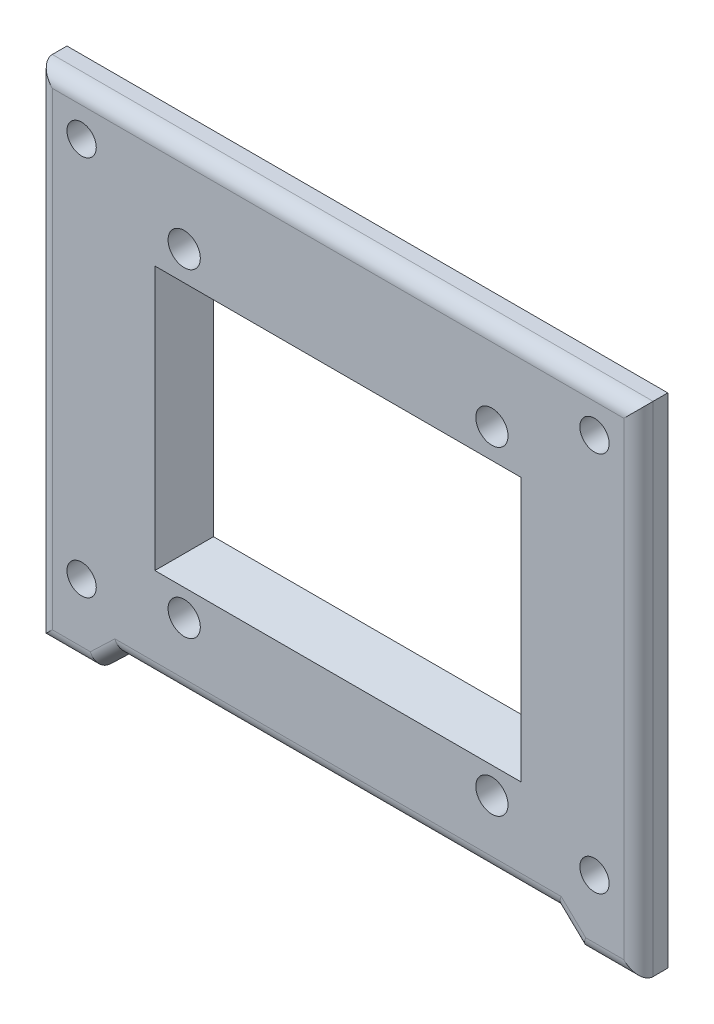
ISO-10303-21;
HEADER;
FILE_DESCRIPTION(('STEP AP214'),'2;1');
FILE_NAME('part.step','',(''),(''),'','','');
FILE_SCHEMA(('AUTOMOTIVE_DESIGN { 1 0 10303 214 1 1 1 1 }'));
ENDSEC;
DATA;
#1=APPLICATION_CONTEXT('core data for automotive mechanical design processes');
#2=APPLICATION_PROTOCOL_DEFINITION('international standard','automotive_design',2000,#1);
#3=PRODUCT_CONTEXT('',#1,'mechanical');
#4=PRODUCT('Part','Part','',(#3));
#5=PRODUCT_RELATED_PRODUCT_CATEGORY('part','',(#4));
#6=PRODUCT_DEFINITION_FORMATION('','',#4);
#7=PRODUCT_DEFINITION_CONTEXT('part definition',#1,'design');
#8=PRODUCT_DEFINITION('design','',#6,#7);
#9=PRODUCT_DEFINITION_SHAPE('','',#8);
#10=(LENGTH_UNIT() NAMED_UNIT(*) SI_UNIT(.MILLI.,.METRE.));
#11=(NAMED_UNIT(*) PLANE_ANGLE_UNIT() SI_UNIT($,.RADIAN.));
#12=(NAMED_UNIT(*) SI_UNIT($,.STERADIAN.) SOLID_ANGLE_UNIT());
#13=UNCERTAINTY_MEASURE_WITH_UNIT(LENGTH_MEASURE(1.E-05),#10,'distance_accuracy_value','');
#14=(GEOMETRIC_REPRESENTATION_CONTEXT(3) GLOBAL_UNCERTAINTY_ASSIGNED_CONTEXT((#13)) GLOBAL_UNIT_ASSIGNED_CONTEXT((#10,
#11,#12)) REPRESENTATION_CONTEXT('',''));
#15=CARTESIAN_POINT('',(0.,0.,0.));
#16=DIRECTION('',(0.,0.,1.));
#17=DIRECTION('',(1.,0.,0.));
#18=AXIS2_PLACEMENT_3D('',#15,#16,#17);
#19=CARTESIAN_POINT('',(0.,0.,2.));
#20=DIRECTION('',(0.,0.,1.));
#21=DIRECTION('',(1.,0.,0.));
#22=AXIS2_PLACEMENT_3D('',#19,#20,#21);
#23=PLANE('',#22);
#24=DIRECTION('',(0.,-1.,0.));
#25=VECTOR('',#24,1.);
#26=CARTESIAN_POINT('',(11.5716488957227,0.,2.));
#27=LINE('',#26,#25);
#28=CARTESIAN_POINT('',(11.5716488957227,16.9069626274452,2.));
#29=VERTEX_POINT('',#28);
#30=CARTESIAN_POINT('',(11.5716488957227,-1.09303737255483,2.));
#31=VERTEX_POINT('',#30);
#32=EDGE_CURVE('E54',#29,#31,#27,.T.);
#33=ORIENTED_EDGE('',*,*,#32,.T.);
#34=DIRECTION('',(-1.,0.,0.));
#35=VECTOR('',#34,1.);
#36=CARTESIAN_POINT('',(0.,-1.09303737255483,2.));
#37=LINE('',#36,#35);
#38=CARTESIAN_POINT('',(-13.4283511042773,-1.09303737255483,2.));
#39=VERTEX_POINT('',#38);
#40=EDGE_CURVE('E11',#31,#39,#37,.T.);
#41=ORIENTED_EDGE('',*,*,#40,.T.);
#42=DIRECTION('',(0.,1.,0.));
#43=VECTOR('',#42,1.);
#44=CARTESIAN_POINT('',(-13.4283511042773,0.,2.));
#45=LINE('',#44,#43);
#46=CARTESIAN_POINT('',(-13.4283511042773,16.9069626274452,2.));
#47=VERTEX_POINT('',#46);
#48=EDGE_CURVE('E173',#39,#47,#45,.T.);
#49=ORIENTED_EDGE('',*,*,#48,.T.);
#50=DIRECTION('',(1.,0.,0.));
#51=VECTOR('',#50,1.);
#52=CARTESIAN_POINT('',(0.,16.9069626274452,2.));
#53=LINE('',#52,#51);
#54=EDGE_CURVE('E296',#47,#29,#53,.T.);
#55=ORIENTED_EDGE('',*,*,#54,.T.);
#56=EDGE_LOOP('',(#33,#41,#49,#55));
#57=FACE_BOUND('',#56,.T.);
#58=CARTESIAN_POINT('',(-18.4283511042773,-4.09303737255482,2.));
#59=DIRECTION('',(0.,0.,1.));
#60=DIRECTION('',(1.,0.,0.));
#61=AXIS2_PLACEMENT_3D('',#58,#59,#60);
#62=CIRCLE('',#61,1.);
#63=CARTESIAN_POINT('',(-17.4283511042773,-4.09303737255482,2.));
#64=VERTEX_POINT('',#63);
#65=EDGE_CURVE('E358',#64,#64,#62,.T.);
#66=ORIENTED_EDGE('',*,*,#65,.F.);
#67=EDGE_LOOP('',(#66));
#68=FACE_BOUND('',#67,.T.);
#69=CARTESIAN_POINT('',(16.5716488957227,21.9069626274452,2.));
#70=DIRECTION('',(0.,0.,1.));
#71=DIRECTION('',(1.,0.,0.));
#72=AXIS2_PLACEMENT_3D('',#69,#70,#71);
#73=CIRCLE('',#72,1.);
#74=CARTESIAN_POINT('',(17.5716488957227,21.9069626274452,2.));
#75=VERTEX_POINT('',#74);
#76=EDGE_CURVE('E350',#75,#75,#73,.T.);
#77=ORIENTED_EDGE('',*,*,#76,.F.);
#78=EDGE_LOOP('',(#77));
#79=FACE_BOUND('',#78,.T.);
#80=CARTESIAN_POINT('',(16.5716488957227,-4.09303737255482,2.));
#81=DIRECTION('',(0.,0.,1.));
#82=DIRECTION('',(1.,0.,0.));
#83=AXIS2_PLACEMENT_3D('',#80,#81,#82);
#84=CIRCLE('',#83,1.);
#85=CARTESIAN_POINT('',(17.5716488957227,-4.09303737255482,2.));
#86=VERTEX_POINT('',#85);
#87=EDGE_CURVE('E341',#86,#86,#84,.T.);
#88=ORIENTED_EDGE('',*,*,#87,.F.);
#89=EDGE_LOOP('',(#88));
#90=FACE_BOUND('',#89,.T.);
#91=CARTESIAN_POINT('',(-18.4283511042773,21.9069626274452,2.));
#92=DIRECTION('',(0.,0.,1.));
#93=DIRECTION('',(1.,0.,0.));
#94=AXIS2_PLACEMENT_3D('',#91,#92,#93);
#95=CIRCLE('',#94,1.);
#96=CARTESIAN_POINT('',(-17.4283511042773,21.9069626274452,2.));
#97=VERTEX_POINT('',#96);
#98=EDGE_CURVE('E357',#97,#97,#95,.T.);
#99=ORIENTED_EDGE('',*,*,#98,.F.);
#100=EDGE_LOOP('',(#99));
#101=FACE_BOUND('',#100,.T.);
#102=DIRECTION('',(0.722490361505851,0.691380993035783,0.));
#103=VECTOR('',#102,1.);
#104=CARTESIAN_POINT('',(-16.4477385220579,-6.77054701104897,2.));
#105=LINE('',#104,#103);
#106=CARTESIAN_POINT('',(-17.8297356394171,-8.09303737255482,2.));
#107=VERTEX_POINT('',#106);
#108=CARTESIAN_POINT('',(-16.1577420641619,-6.49303737255482,2.));
#109=VERTEX_POINT('',#108);
#110=EDGE_CURVE('E261',#107,#109,#105,.T.);
#111=ORIENTED_EDGE('',*,*,#110,.T.);
#112=DIRECTION('',(1.,0.,0.));
#113=VECTOR('',#112,1.);
#114=CARTESIAN_POINT('',(13.8996553204676,-6.49303737255482,2.));
#115=LINE('',#114,#113);
#116=CARTESIAN_POINT('',(14.3010398556073,-6.49303737255482,2.));
#117=VERTEX_POINT('',#116);
#118=EDGE_CURVE('E268',#109,#117,#115,.T.);
#119=ORIENTED_EDGE('',*,*,#118,.T.);
#120=DIRECTION('',(0.722490361505851,-0.691380993035783,0.));
#121=VECTOR('',#120,1.);
#122=CARTESIAN_POINT('',(16.2630298887585,-8.37054701104897,2.));
#123=LINE('',#122,#121);
#124=CARTESIAN_POINT('',(15.9730334308625,-8.09303737255482,2.));
#125=VERTEX_POINT('',#124);
#126=EDGE_CURVE('E264',#117,#125,#123,.T.);
#127=ORIENTED_EDGE('',*,*,#126,.T.);
#128=DIRECTION('',(1.,0.,0.));
#129=VECTOR('',#128,1.);
#130=CARTESIAN_POINT('',(19.5716488957227,-8.09303737255483,2.));
#131=LINE('',#130,#129);
#132=CARTESIAN_POINT('',(18.5716488957227,-8.09303737255483,2.));
#133=VERTEX_POINT('',#132);
#134=EDGE_CURVE('E255',#125,#133,#131,.T.);
#135=ORIENTED_EDGE('',*,*,#134,.T.);
#136=DIRECTION('',(0.,1.,0.));
#137=VECTOR('',#136,1.);
#138=CARTESIAN_POINT('',(18.5716488957227,24.9069626274452,2.));
#139=LINE('',#138,#137);
#140=CARTESIAN_POINT('',(18.5716488957227,23.9069626274452,2.));
#141=VERTEX_POINT('',#140);
#142=EDGE_CURVE('E252',#133,#141,#139,.T.);
#143=ORIENTED_EDGE('',*,*,#142,.T.);
#144=DIRECTION('',(-1.,0.,0.));
#145=VECTOR('',#144,1.);
#146=CARTESIAN_POINT('',(-21.4283511042773,23.9069626274452,2.));
#147=LINE('',#146,#145);
#148=CARTESIAN_POINT('',(-20.4283511042773,23.9069626274452,2.));
#149=VERTEX_POINT('',#148);
#150=EDGE_CURVE('E249',#141,#149,#147,.T.);
#151=ORIENTED_EDGE('',*,*,#150,.T.);
#152=DIRECTION('',(0.,-1.,0.));
#153=VECTOR('',#152,1.);
#154=CARTESIAN_POINT('',(-20.4283511042773,-9.09303737255483,2.));
#155=LINE('',#154,#153);
#156=CARTESIAN_POINT('',(-20.4283511042773,-8.09303737255483,2.));
#157=VERTEX_POINT('',#156);
#158=EDGE_CURVE('E246',#149,#157,#155,.T.);
#159=ORIENTED_EDGE('',*,*,#158,.T.);
#160=DIRECTION('',(1.,0.,0.));
#161=VECTOR('',#160,1.);
#162=CARTESIAN_POINT('',(-17.4283511042773,-8.09303737255482,2.));
#163=LINE('',#162,#161);
#164=EDGE_CURVE('E258',#157,#107,#163,.T.);
#165=ORIENTED_EDGE('',*,*,#164,.T.);
#166=EDGE_LOOP('',(#111,#119,#127,#135,#143,#151,#159,#165));
#167=FACE_BOUND('',#166,.T.);
#168=CARTESIAN_POINT('',(9.57164889572272,18.9069626274452,2.));
#169=DIRECTION('',(0.,0.,1.));
#170=DIRECTION('',(1.,0.,0.));
#171=AXIS2_PLACEMENT_3D('',#168,#169,#170);
#172=CIRCLE('',#171,1.1);
#173=CARTESIAN_POINT('',(10.6716488957227,18.9069626274452,2.));
#174=VERTEX_POINT('',#173);
#175=EDGE_CURVE('E383',#174,#174,#172,.T.);
#176=ORIENTED_EDGE('',*,*,#175,.F.);
#177=EDGE_LOOP('',(#176));
#178=FACE_BOUND('',#177,.T.);
#179=CARTESIAN_POINT('',(-11.4283511042773,18.9069626274452,2.));
#180=DIRECTION('',(0.,0.,1.));
#181=DIRECTION('',(1.,0.,0.));
#182=AXIS2_PLACEMENT_3D('',#179,#180,#181);
#183=CIRCLE('',#182,1.1);
#184=CARTESIAN_POINT('',(-10.3283511042773,18.9069626274452,2.));
#185=VERTEX_POINT('',#184);
#186=EDGE_CURVE('E170',#185,#185,#183,.T.);
#187=ORIENTED_EDGE('',*,*,#186,.F.);
#188=EDGE_LOOP('',(#187));
#189=FACE_BOUND('',#188,.T.);
#190=CARTESIAN_POINT('',(-11.4283511042773,-2.89303737255482,2.));
#191=DIRECTION('',(0.,0.,1.));
#192=DIRECTION('',(1.,0.,0.));
#193=AXIS2_PLACEMENT_3D('',#190,#191,#192);
#194=CIRCLE('',#193,1.1);
#195=CARTESIAN_POINT('',(-10.3283511042773,-2.89303737255482,2.));
#196=VERTEX_POINT('',#195);
#197=EDGE_CURVE('E391',#196,#196,#194,.T.);
#198=ORIENTED_EDGE('',*,*,#197,.F.);
#199=EDGE_LOOP('',(#198));
#200=FACE_BOUND('',#199,.T.);
#201=CARTESIAN_POINT('',(9.57164889572272,-2.89303737255482,2.));
#202=DIRECTION('',(0.,0.,1.));
#203=DIRECTION('',(1.,0.,0.));
#204=AXIS2_PLACEMENT_3D('',#201,#202,#203);
#205=CIRCLE('',#204,1.1);
#206=CARTESIAN_POINT('',(10.6716488957227,-2.89303737255482,2.));
#207=VERTEX_POINT('',#206);
#208=EDGE_CURVE('E375',#207,#207,#205,.T.);
#209=ORIENTED_EDGE('',*,*,#208,.F.);
#210=EDGE_LOOP('',(#209));
#211=FACE_BOUND('',#210,.T.);
#212=ADVANCED_FACE('F43',(#57,#68,#79,#90,#101,#167,#178,#189,#200,#211),#23,.T.);
#213=CARTESIAN_POINT('',(0.,0.,0.));
#214=DIRECTION('',(0.,0.,1.));
#215=DIRECTION('',(1.,0.,0.));
#216=AXIS2_PLACEMENT_3D('',#213,#214,#215);
#217=PLANE('',#216);
#218=CARTESIAN_POINT('',(-18.4283511042773,-4.09303737255482,0.));
#219=DIRECTION('',(0.,0.,1.));
#220=DIRECTION('',(1.,0.,0.));
#221=AXIS2_PLACEMENT_3D('',#218,#219,#220);
#222=CIRCLE('',#221,1.);
#223=CARTESIAN_POINT('',(-17.4283511042773,-4.09303737255482,0.));
#224=VERTEX_POINT('',#223);
#225=EDGE_CURVE('E353',#224,#224,#222,.T.);
#226=ORIENTED_EDGE('',*,*,#225,.T.);
#227=EDGE_LOOP('',(#226));
#228=FACE_BOUND('',#227,.T.);
#229=CARTESIAN_POINT('',(16.5716488957227,21.9069626274452,0.));
#230=DIRECTION('',(0.,0.,1.));
#231=DIRECTION('',(1.,0.,0.));
#232=AXIS2_PLACEMENT_3D('',#229,#230,#231);
#233=CIRCLE('',#232,1.);
#234=CARTESIAN_POINT('',(17.5716488957227,21.9069626274452,0.));
#235=VERTEX_POINT('',#234);
#236=EDGE_CURVE('E362',#235,#235,#233,.T.);
#237=ORIENTED_EDGE('',*,*,#236,.T.);
#238=EDGE_LOOP('',(#237));
#239=FACE_BOUND('',#238,.T.);
#240=CARTESIAN_POINT('',(16.5716488957227,-4.09303737255482,0.));
#241=DIRECTION('',(0.,0.,1.));
#242=DIRECTION('',(1.,0.,0.));
#243=AXIS2_PLACEMENT_3D('',#240,#241,#242);
#244=CIRCLE('',#243,1.);
#245=CARTESIAN_POINT('',(17.5716488957227,-4.09303737255482,0.));
#246=VERTEX_POINT('',#245);
#247=EDGE_CURVE('E344',#246,#246,#244,.T.);
#248=ORIENTED_EDGE('',*,*,#247,.T.);
#249=EDGE_LOOP('',(#248));
#250=FACE_BOUND('',#249,.T.);
#251=CARTESIAN_POINT('',(-18.4283511042773,21.9069626274452,0.));
#252=DIRECTION('',(0.,0.,1.));
#253=DIRECTION('',(1.,0.,0.));
#254=AXIS2_PLACEMENT_3D('',#251,#252,#253);
#255=CIRCLE('',#254,1.);
#256=CARTESIAN_POINT('',(-17.4283511042773,21.9069626274452,0.));
#257=VERTEX_POINT('',#256);
#258=EDGE_CURVE('E301',#257,#257,#255,.T.);
#259=ORIENTED_EDGE('',*,*,#258,.T.);
#260=EDGE_LOOP('',(#259));
#261=FACE_BOUND('',#260,.T.);
#262=DIRECTION('',(0.,-1.,0.));
#263=VECTOR('',#262,1.);
#264=CARTESIAN_POINT('',(-21.4283511042773,24.9069626274452,0.));
#265=LINE('',#264,#263);
#266=CARTESIAN_POINT('',(-21.4283511042773,24.9069626274452,0.));
#267=VERTEX_POINT('',#266);
#268=CARTESIAN_POINT('',(-21.4283511042773,-9.09303737255483,0.));
#269=VERTEX_POINT('',#268);
#270=EDGE_CURVE('E190',#267,#269,#265,.T.);
#271=ORIENTED_EDGE('',*,*,#270,.F.);
#272=DIRECTION('',(-1.,0.,0.));
#273=VECTOR('',#272,1.);
#274=CARTESIAN_POINT('',(-21.4283511042773,24.9069626274452,0.));
#275=LINE('',#274,#273);
#276=CARTESIAN_POINT('',(19.5716488957227,24.9069626274452,0.));
#277=VERTEX_POINT('',#276);
#278=EDGE_CURVE('E218',#277,#267,#275,.T.);
#279=ORIENTED_EDGE('',*,*,#278,.F.);
#280=DIRECTION('',(0.,1.,0.));
#281=VECTOR('',#280,1.);
#282=CARTESIAN_POINT('',(19.5716488957227,24.9069626274452,0.));
#283=LINE('',#282,#281);
#284=CARTESIAN_POINT('',(19.5716488957227,-9.09303737255483,0.));
#285=VERTEX_POINT('',#284);
#286=EDGE_CURVE('E214',#285,#277,#283,.T.);
#287=ORIENTED_EDGE('',*,*,#286,.F.);
#288=DIRECTION('',(1.,0.,0.));
#289=VECTOR('',#288,1.);
#290=CARTESIAN_POINT('',(17.6967719504283,-9.09303737255482,0.));
#291=LINE('',#290,#289);
#292=CARTESIAN_POINT('',(15.5716488957227,-9.09303737255482,0.));
#293=VERTEX_POINT('',#292);
#294=EDGE_CURVE('E210',#293,#285,#291,.T.);
#295=ORIENTED_EDGE('',*,*,#294,.F.);
#296=DIRECTION('',(0.722490361505851,-0.691380993035783,0.));
#297=VECTOR('',#296,1.);
#298=CARTESIAN_POINT('',(15.5716488957227,-9.09303737255482,0.));
#299=LINE('',#298,#297);
#300=CARTESIAN_POINT('',(13.8996553204676,-7.49303737255482,0.));
#301=VERTEX_POINT('',#300);
#302=EDGE_CURVE('E206',#301,#293,#299,.T.);
#303=ORIENTED_EDGE('',*,*,#302,.F.);
#304=DIRECTION('',(1.,0.,0.));
#305=VECTOR('',#304,1.);
#306=CARTESIAN_POINT('',(-15.7563575290221,-7.49303737255482,0.));
#307=LINE('',#306,#305);
#308=CARTESIAN_POINT('',(-15.7563575290221,-7.49303737255482,0.));
#309=VERTEX_POINT('',#308);
#310=EDGE_CURVE('E202',#309,#301,#307,.T.);
#311=ORIENTED_EDGE('',*,*,#310,.F.);
#312=DIRECTION('',(0.722490361505851,0.691380993035783,0.));
#313=VECTOR('',#312,1.);
#314=CARTESIAN_POINT('',(-17.4283511042773,-9.09303737255482,0.));
#315=LINE('',#314,#313);
#316=CARTESIAN_POINT('',(-17.4283511042773,-9.09303737255482,0.));
#317=VERTEX_POINT('',#316);
#318=EDGE_CURVE('E198',#317,#309,#315,.T.);
#319=ORIENTED_EDGE('',*,*,#318,.F.);
#320=DIRECTION('',(1.,0.,0.));
#321=VECTOR('',#320,1.);
#322=CARTESIAN_POINT('',(-21.4283511042773,-9.09303737255483,0.));
#323=LINE('',#322,#321);
#324=EDGE_CURVE('E194',#269,#317,#323,.T.);
#325=ORIENTED_EDGE('',*,*,#324,.F.);
#326=EDGE_LOOP('',(#271,#279,#287,#295,#303,#311,#319,#325));
#327=FACE_BOUND('',#326,.T.);
#328=DIRECTION('',(0.,-1.,0.));
#329=VECTOR('',#328,1.);
#330=CARTESIAN_POINT('',(-11.4283511042773,14.9069626274452,0.));
#331=LINE('',#330,#329);
#332=CARTESIAN_POINT('',(-11.4283511042773,14.9069626274452,0.));
#333=VERTEX_POINT('',#332);
#334=CARTESIAN_POINT('',(-11.4283511042773,0.906962627445175,0.));
#335=VERTEX_POINT('',#334);
#336=EDGE_CURVE('E160',#333,#335,#331,.T.);
#337=ORIENTED_EDGE('',*,*,#336,.T.);
#338=DIRECTION('',(1.,0.,0.));
#339=VECTOR('',#338,1.);
#340=CARTESIAN_POINT('',(-11.4283511042773,0.906962627445175,0.));
#341=LINE('',#340,#339);
#342=CARTESIAN_POINT('',(9.57164889572272,0.906962627445175,0.));
#343=VERTEX_POINT('',#342);
#344=EDGE_CURVE('E163',#335,#343,#341,.T.);
#345=ORIENTED_EDGE('',*,*,#344,.T.);
#346=DIRECTION('',(0.,1.,0.));
#347=VECTOR('',#346,1.);
#348=CARTESIAN_POINT('',(9.57164889572272,14.9069626274452,0.));
#349=LINE('',#348,#347);
#350=CARTESIAN_POINT('',(9.57164889572272,14.9069626274452,0.));
#351=VERTEX_POINT('',#350);
#352=EDGE_CURVE('E182',#343,#351,#349,.T.);
#353=ORIENTED_EDGE('',*,*,#352,.T.);
#354=DIRECTION('',(-1.,0.,0.));
#355=VECTOR('',#354,1.);
#356=CARTESIAN_POINT('',(-11.4283511042773,14.9069626274452,0.));
#357=LINE('',#356,#355);
#358=EDGE_CURVE('E165',#351,#333,#357,.T.);
#359=ORIENTED_EDGE('',*,*,#358,.T.);
#360=EDGE_LOOP('',(#337,#345,#353,#359));
#361=FACE_BOUND('',#360,.T.);
#362=CARTESIAN_POINT('',(-11.4283511042773,18.9069626274452,0.));
#363=DIRECTION('',(0.,0.,1.));
#364=DIRECTION('',(1.,0.,0.));
#365=AXIS2_PLACEMENT_3D('',#362,#363,#364);
#366=CIRCLE('',#365,1.1);
#367=CARTESIAN_POINT('',(-10.3283511042773,18.9069626274452,0.));
#368=VERTEX_POINT('',#367);
#369=EDGE_CURVE('E395',#368,#368,#366,.T.);
#370=ORIENTED_EDGE('',*,*,#369,.T.);
#371=EDGE_LOOP('',(#370));
#372=FACE_BOUND('',#371,.T.);
#373=CARTESIAN_POINT('',(-11.4283511042773,-2.89303737255482,0.));
#374=DIRECTION('',(0.,0.,1.));
#375=DIRECTION('',(1.,0.,0.));
#376=AXIS2_PLACEMENT_3D('',#373,#374,#375);
#377=CIRCLE('',#376,1.1);
#378=CARTESIAN_POINT('',(-10.3283511042773,-2.89303737255482,0.));
#379=VERTEX_POINT('',#378);
#380=EDGE_CURVE('E387',#379,#379,#377,.T.);
#381=ORIENTED_EDGE('',*,*,#380,.T.);
#382=EDGE_LOOP('',(#381));
#383=FACE_BOUND('',#382,.T.);
#384=CARTESIAN_POINT('',(9.57164889572272,18.9069626274452,0.));
#385=DIRECTION('',(0.,0.,1.));
#386=DIRECTION('',(1.,0.,0.));
#387=AXIS2_PLACEMENT_3D('',#384,#385,#386);
#388=CIRCLE('',#387,1.1);
#389=CARTESIAN_POINT('',(10.6716488957227,18.9069626274452,0.));
#390=VERTEX_POINT('',#389);
#391=EDGE_CURVE('E379',#390,#390,#388,.T.);
#392=ORIENTED_EDGE('',*,*,#391,.T.);
#393=EDGE_LOOP('',(#392));
#394=FACE_BOUND('',#393,.T.);
#395=CARTESIAN_POINT('',(9.57164889572272,-2.89303737255482,0.));
#396=DIRECTION('',(0.,0.,1.));
#397=DIRECTION('',(1.,0.,0.));
#398=AXIS2_PLACEMENT_3D('',#395,#396,#397);
#399=CIRCLE('',#398,1.1);
#400=CARTESIAN_POINT('',(10.6716488957227,-2.89303737255482,0.));
#401=VERTEX_POINT('',#400);
#402=EDGE_CURVE('E328',#401,#401,#399,.T.);
#403=ORIENTED_EDGE('',*,*,#402,.T.);
#404=EDGE_LOOP('',(#403));
#405=FACE_BOUND('',#404,.T.);
#406=ADVANCED_FACE('F161',(#228,#239,#250,#261,#327,#361,#372,#383,#394,#405),#217,.F.);
#407=CARTESIAN_POINT('',(-21.4283511042773,24.9069626274452,2.));
#408=DIRECTION('',(1.,0.,0.));
#409=DIRECTION('',(0.,0.,-1.));
#410=AXIS2_PLACEMENT_3D('',#407,#408,#409);
#411=PLANE('',#410);
#412=DIRECTION('',(0.,0.,-1.));
#413=VECTOR('',#412,1.);
#414=CARTESIAN_POINT('',(-21.4283511042773,-9.09303737255483,2.));
#415=LINE('',#414,#413);
#416=CARTESIAN_POINT('',(-21.4283511042773,-9.09303737255483,1.));
#417=VERTEX_POINT('',#416);
#418=EDGE_CURVE('E243',#417,#269,#415,.T.);
#419=ORIENTED_EDGE('',*,*,#418,.F.);
#420=DIRECTION('',(0.,-1.,0.));
#421=VECTOR('',#420,1.);
#422=CARTESIAN_POINT('',(-21.4283511042773,24.9069626274452,1.));
#423=LINE('',#422,#421);
#424=CARTESIAN_POINT('',(-21.4283511042773,24.9069626274452,1.));
#425=VERTEX_POINT('',#424);
#426=EDGE_CURVE('E293',#417,#425,#423,.F.);
#427=ORIENTED_EDGE('',*,*,#426,.T.);
#428=DIRECTION('',(0.,0.,-1.));
#429=VECTOR('',#428,1.);
#430=CARTESIAN_POINT('',(-21.4283511042773,24.9069626274452,2.));
#431=LINE('',#430,#429);
#432=EDGE_CURVE('E222',#425,#267,#431,.T.);
#433=ORIENTED_EDGE('',*,*,#432,.T.);
#434=ORIENTED_EDGE('',*,*,#270,.T.);
#435=EDGE_LOOP('',(#419,#427,#433,#434));
#436=FACE_BOUND('',#435,.T.);
#437=ADVANCED_FACE('F427',(#436),#411,.F.);
#438=CARTESIAN_POINT('',(-21.4283511042773,-9.09303737255483,2.));
#439=DIRECTION('',(0.,1.,0.));
#440=DIRECTION('',(-1.,0.,0.));
#441=AXIS2_PLACEMENT_3D('',#438,#439,#440);
#442=PLANE('',#441);
#443=DIRECTION('',(0.,0.,-1.));
#444=VECTOR('',#443,1.);
#445=CARTESIAN_POINT('',(-17.4283511042773,-9.09303737255482,2.));
#446=LINE('',#445,#444);
#447=CARTESIAN_POINT('',(-17.4283511042773,-9.09303737255482,1.));
#448=VERTEX_POINT('',#447);
#449=EDGE_CURVE('E240',#448,#317,#446,.T.);
#450=ORIENTED_EDGE('',*,*,#449,.F.);
#451=DIRECTION('',(1.,0.,0.));
#452=VECTOR('',#451,1.);
#453=CARTESIAN_POINT('',(-21.4283511042773,-9.09303737255483,1.));
#454=LINE('',#453,#452);
#455=EDGE_CURVE('E278',#448,#417,#454,.F.);
#456=ORIENTED_EDGE('',*,*,#455,.T.);
#457=ORIENTED_EDGE('',*,*,#418,.T.);
#458=ORIENTED_EDGE('',*,*,#324,.T.);
#459=EDGE_LOOP('',(#450,#456,#457,#458));
#460=FACE_BOUND('',#459,.T.);
#461=ADVANCED_FACE('F450',(#460),#442,.F.);
#462=CARTESIAN_POINT('',(-17.4283511042773,-9.09303737255482,2.));
#463=DIRECTION('',(-0.691380993035783,0.722490361505851,0.));
#464=DIRECTION('',(-0.722490361505851,-0.691380993035783,0.));
#465=AXIS2_PLACEMENT_3D('',#462,#463,#464);
#466=PLANE('',#465);
#467=DIRECTION('',(0.,0.,-1.));
#468=VECTOR('',#467,1.);
#469=CARTESIAN_POINT('',(-15.7563575290221,-7.49303737255482,2.));
#470=LINE('',#469,#468);
#471=CARTESIAN_POINT('',(-15.7563575290221,-7.49303737255482,1.));
#472=VERTEX_POINT('',#471);
#473=EDGE_CURVE('E237',#472,#309,#470,.T.);
#474=ORIENTED_EDGE('',*,*,#473,.F.);
#475=DIRECTION('',(0.722490361505851,0.691380993035783,0.));
#476=VECTOR('',#475,1.);
#477=CARTESIAN_POINT('',(-17.4283511042773,-9.09303737255482,1.));
#478=LINE('',#477,#476);
#479=EDGE_CURVE('E275',#472,#448,#478,.F.);
#480=ORIENTED_EDGE('',*,*,#479,.T.);
#481=ORIENTED_EDGE('',*,*,#449,.T.);
#482=ORIENTED_EDGE('',*,*,#318,.T.);
#483=EDGE_LOOP('',(#474,#480,#481,#482));
#484=FACE_BOUND('',#483,.T.);
#485=ADVANCED_FACE('F446',(#484),#466,.F.);
#486=CARTESIAN_POINT('',(-15.7563575290221,-7.49303737255482,2.));
#487=DIRECTION('',(0.,1.,0.));
#488=DIRECTION('',(0.,0.,1.));
#489=AXIS2_PLACEMENT_3D('',#486,#487,#488);
#490=PLANE('',#489);
#491=DIRECTION('',(0.,0.,-1.));
#492=VECTOR('',#491,1.);
#493=CARTESIAN_POINT('',(13.8996553204676,-7.49303737255482,2.));
#494=LINE('',#493,#492);
#495=CARTESIAN_POINT('',(13.8996553204676,-7.49303737255482,1.));
#496=VERTEX_POINT('',#495);
#497=EDGE_CURVE('E234',#496,#301,#494,.T.);
#498=ORIENTED_EDGE('',*,*,#497,.F.);
#499=DIRECTION('',(1.,0.,0.));
#500=VECTOR('',#499,1.);
#501=CARTESIAN_POINT('',(-15.7563575290221,-7.49303737255482,1.));
#502=LINE('',#501,#500);
#503=EDGE_CURVE('E281',#496,#472,#502,.F.);
#504=ORIENTED_EDGE('',*,*,#503,.T.);
#505=ORIENTED_EDGE('',*,*,#473,.T.);
#506=ORIENTED_EDGE('',*,*,#310,.T.);
#507=EDGE_LOOP('',(#498,#504,#505,#506));
#508=FACE_BOUND('',#507,.T.);
#509=ADVANCED_FACE('F442',(#508),#490,.F.);
#510=CARTESIAN_POINT('',(15.5716488957227,-9.09303737255482,2.));
#511=DIRECTION('',(0.691380993035783,0.722490361505851,0.));
#512=DIRECTION('',(-0.722490361505851,0.691380993035783,0.));
#513=AXIS2_PLACEMENT_3D('',#510,#511,#512);
#514=PLANE('',#513);
#515=DIRECTION('',(0.,0.,-1.));
#516=VECTOR('',#515,1.);
#517=CARTESIAN_POINT('',(15.5716488957227,-9.09303737255482,2.));
#518=LINE('',#517,#516);
#519=CARTESIAN_POINT('',(15.5716488957227,-9.09303737255482,1.));
#520=VERTEX_POINT('',#519);
#521=EDGE_CURVE('E231',#520,#293,#518,.T.);
#522=ORIENTED_EDGE('',*,*,#521,.F.);
#523=DIRECTION('',(0.722490361505851,-0.691380993035783,0.));
#524=VECTOR('',#523,1.);
#525=CARTESIAN_POINT('',(13.8996553204676,-7.49303737255483,1.));
#526=LINE('',#525,#524);
#527=EDGE_CURVE('E271',#520,#496,#526,.F.);
#528=ORIENTED_EDGE('',*,*,#527,.T.);
#529=ORIENTED_EDGE('',*,*,#497,.T.);
#530=ORIENTED_EDGE('',*,*,#302,.T.);
#531=EDGE_LOOP('',(#522,#528,#529,#530));
#532=FACE_BOUND('',#531,.T.);
#533=ADVANCED_FACE('F438',(#532),#514,.F.);
#534=CARTESIAN_POINT('',(17.6967719504283,-9.09303737255482,2.));
#535=DIRECTION('',(0.,1.,0.));
#536=DIRECTION('',(-1.,0.,0.));
#537=AXIS2_PLACEMENT_3D('',#534,#535,#536);
#538=PLANE('',#537);
#539=DIRECTION('',(0.,0.,-1.));
#540=VECTOR('',#539,1.);
#541=CARTESIAN_POINT('',(19.5716488957227,-9.09303737255483,2.));
#542=LINE('',#541,#540);
#543=CARTESIAN_POINT('',(19.5716488957227,-9.09303737255483,1.));
#544=VERTEX_POINT('',#543);
#545=EDGE_CURVE('E228',#544,#285,#542,.T.);
#546=ORIENTED_EDGE('',*,*,#545,.F.);
#547=DIRECTION('',(1.,0.,0.));
#548=VECTOR('',#547,1.);
#549=CARTESIAN_POINT('',(15.5716488957227,-9.09303737255482,1.));
#550=LINE('',#549,#548);
#551=EDGE_CURVE('E284',#544,#520,#550,.F.);
#552=ORIENTED_EDGE('',*,*,#551,.T.);
#553=ORIENTED_EDGE('',*,*,#521,.T.);
#554=ORIENTED_EDGE('',*,*,#294,.T.);
#555=EDGE_LOOP('',(#546,#552,#553,#554));
#556=FACE_BOUND('',#555,.T.);
#557=ADVANCED_FACE('F434',(#556),#538,.F.);
#558=CARTESIAN_POINT('',(19.5716488957227,24.9069626274452,2.));
#559=DIRECTION('',(-1.,0.,0.));
#560=DIRECTION('',(0.,0.,1.));
#561=AXIS2_PLACEMENT_3D('',#558,#559,#560);
#562=PLANE('',#561);
#563=DIRECTION('',(0.,0.,-1.));
#564=VECTOR('',#563,1.);
#565=CARTESIAN_POINT('',(19.5716488957227,24.9069626274452,2.));
#566=LINE('',#565,#564);
#567=CARTESIAN_POINT('',(19.5716488957227,24.9069626274452,1.));
#568=VERTEX_POINT('',#567);
#569=EDGE_CURVE('E225',#568,#277,#566,.T.);
#570=ORIENTED_EDGE('',*,*,#569,.F.);
#571=DIRECTION('',(0.,1.,0.));
#572=VECTOR('',#571,1.);
#573=CARTESIAN_POINT('',(19.5716488957227,-9.09303737255483,1.));
#574=LINE('',#573,#572);
#575=EDGE_CURVE('E287',#568,#544,#574,.F.);
#576=ORIENTED_EDGE('',*,*,#575,.T.);
#577=ORIENTED_EDGE('',*,*,#545,.T.);
#578=ORIENTED_EDGE('',*,*,#286,.T.);
#579=EDGE_LOOP('',(#570,#576,#577,#578));
#580=FACE_BOUND('',#579,.T.);
#581=ADVANCED_FACE('F419',(#580),#562,.F.);
#582=CARTESIAN_POINT('',(-21.4283511042773,24.9069626274452,2.));
#583=DIRECTION('',(0.,-1.,0.));
#584=DIRECTION('',(1.,0.,0.));
#585=AXIS2_PLACEMENT_3D('',#582,#583,#584);
#586=PLANE('',#585);
#587=ORIENTED_EDGE('',*,*,#432,.F.);
#588=DIRECTION('',(-1.,0.,0.));
#589=VECTOR('',#588,1.);
#590=CARTESIAN_POINT('',(19.5716488957227,24.9069626274452,1.));
#591=LINE('',#590,#589);
#592=EDGE_CURVE('E290',#425,#568,#591,.F.);
#593=ORIENTED_EDGE('',*,*,#592,.T.);
#594=ORIENTED_EDGE('',*,*,#569,.T.);
#595=ORIENTED_EDGE('',*,*,#278,.T.);
#596=EDGE_LOOP('',(#587,#593,#594,#595));
#597=FACE_BOUND('',#596,.T.);
#598=ADVANCED_FACE('F409',(#597),#586,.F.);
#599=CARTESIAN_POINT('',(-11.4283511042773,18.9069626274452,2.));
#600=DIRECTION('',(0.,0.,-1.));
#601=DIRECTION('',(-1.,0.,0.));
#602=AXIS2_PLACEMENT_3D('',#599,#600,#601);
#603=CYLINDRICAL_SURFACE('',#602,1.1);
#604=ORIENTED_EDGE('',*,*,#186,.T.);
#605=EDGE_LOOP('',(#604));
#606=FACE_BOUND('',#605,.T.);
#607=ORIENTED_EDGE('',*,*,#369,.F.);
#608=EDGE_LOOP('',(#607));
#609=FACE_BOUND('',#608,.T.);
#610=ADVANCED_FACE('F406',(#606,#609),#603,.F.);
#611=CARTESIAN_POINT('',(-11.4283511042773,-2.89303737255482,2.));
#612=DIRECTION('',(0.,0.,-1.));
#613=DIRECTION('',(-1.,0.,0.));
#614=AXIS2_PLACEMENT_3D('',#611,#612,#613);
#615=CYLINDRICAL_SURFACE('',#614,1.1);
#616=ORIENTED_EDGE('',*,*,#197,.T.);
#617=EDGE_LOOP('',(#616));
#618=FACE_BOUND('',#617,.T.);
#619=ORIENTED_EDGE('',*,*,#380,.F.);
#620=EDGE_LOOP('',(#619));
#621=FACE_BOUND('',#620,.T.);
#622=ADVANCED_FACE('F408',(#618,#621),#615,.F.);
#623=CARTESIAN_POINT('',(9.57164889572272,18.9069626274452,2.));
#624=DIRECTION('',(0.,0.,-1.));
#625=DIRECTION('',(-1.,0.,0.));
#626=AXIS2_PLACEMENT_3D('',#623,#624,#625);
#627=CYLINDRICAL_SURFACE('',#626,1.1);
#628=ORIENTED_EDGE('',*,*,#175,.T.);
#629=EDGE_LOOP('',(#628));
#630=FACE_BOUND('',#629,.T.);
#631=ORIENTED_EDGE('',*,*,#391,.F.);
#632=EDGE_LOOP('',(#631));
#633=FACE_BOUND('',#632,.T.);
#634=ADVANCED_FACE('F416',(#630,#633),#627,.F.);
#635=CARTESIAN_POINT('',(9.57164889572272,-2.89303737255482,2.));
#636=DIRECTION('',(0.,0.,-1.));
#637=DIRECTION('',(-1.,0.,0.));
#638=AXIS2_PLACEMENT_3D('',#635,#636,#637);
#639=CYLINDRICAL_SURFACE('',#638,1.1);
#640=ORIENTED_EDGE('',*,*,#208,.T.);
#641=EDGE_LOOP('',(#640));
#642=FACE_BOUND('',#641,.T.);
#643=ORIENTED_EDGE('',*,*,#402,.F.);
#644=EDGE_LOOP('',(#643));
#645=FACE_BOUND('',#644,.T.);
#646=ADVANCED_FACE('F490',(#642,#645),#639,.F.);
#647=CARTESIAN_POINT('',(-20.4283511042773,0.,1.));
#648=DIRECTION('',(0.,1.,0.));
#649=DIRECTION('',(0.,0.,1.));
#650=AXIS2_PLACEMENT_3D('',#647,#648,#649);
#651=CYLINDRICAL_SURFACE('',#650,1.);
#652=CARTESIAN_POINT('',(-20.4283511042773,23.9069626274452,1.));
#653=DIRECTION('',(0.707106781186547,0.707106781186547,0.));
#654=DIRECTION('',(-0.707106781186548,0.707106781186547,0.));
#655=AXIS2_PLACEMENT_3D('',#652,#653,#654);
#656=ELLIPSE('',#655,1.41421356237309,1.);
#657=EDGE_CURVE('E320',#425,#149,#656,.T.);
#658=ORIENTED_EDGE('',*,*,#657,.F.);
#659=ORIENTED_EDGE('',*,*,#426,.F.);
#660=CARTESIAN_POINT('',(-20.4283511042773,-8.09303737255483,1.));
#661=DIRECTION('',(-0.707106781186548,0.707106781186547,0.));
#662=DIRECTION('',(0.707106781186547,0.707106781186548,0.));
#663=AXIS2_PLACEMENT_3D('',#660,#661,#662);
#664=ELLIPSE('',#663,1.4142135623731,1.);
#665=EDGE_CURVE('E324',#157,#417,#664,.F.);
#666=ORIENTED_EDGE('',*,*,#665,.F.);
#667=ORIENTED_EDGE('',*,*,#158,.F.);
#668=EDGE_LOOP('',(#658,#659,#666,#667));
#669=FACE_BOUND('',#668,.T.);
#670=ADVANCED_FACE('F486',(#669),#651,.T.);
#671=CARTESIAN_POINT('',(0.,-8.09303737255482,1.));
#672=DIRECTION('',(-1.,0.,0.));
#673=DIRECTION('',(0.,-1.,0.));
#674=AXIS2_PLACEMENT_3D('',#671,#672,#673);
#675=CYLINDRICAL_SURFACE('',#674,1.);
#676=ORIENTED_EDGE('',*,*,#665,.T.);
#677=ORIENTED_EDGE('',*,*,#455,.F.);
#678=CARTESIAN_POINT('',(-17.8297356394171,-8.09303737255483,1.));
#679=DIRECTION('',(-0.928032963182303,-0.372498079521324,0.));
#680=DIRECTION('',(-0.372498079521324,0.928032963182303,0.));
#681=AXIS2_PLACEMENT_3D('',#678,#679,#680);
#682=ELLIPSE('',#681,1.07754793167143,1.);
#683=EDGE_CURVE('E316',#107,#448,#682,.F.);
#684=ORIENTED_EDGE('',*,*,#683,.F.);
#685=ORIENTED_EDGE('',*,*,#164,.F.);
#686=EDGE_LOOP('',(#676,#677,#684,#685));
#687=FACE_BOUND('',#686,.T.);
#688=ADVANCED_FACE('F482',(#687),#675,.T.);
#689=CARTESIAN_POINT('',(0.,23.9069626274452,1.));
#690=DIRECTION('',(1.,0.,0.));
#691=DIRECTION('',(0.,1.,0.));
#692=AXIS2_PLACEMENT_3D('',#689,#690,#691);
#693=CYLINDRICAL_SURFACE('',#692,1.);
#694=ORIENTED_EDGE('',*,*,#657,.T.);
#695=ORIENTED_EDGE('',*,*,#150,.F.);
#696=CARTESIAN_POINT('',(18.5716488957227,23.9069626274452,1.));
#697=DIRECTION('',(0.707106781186548,-0.707106781186547,0.));
#698=DIRECTION('',(0.707106781186547,0.707106781186547,0.));
#699=AXIS2_PLACEMENT_3D('',#696,#697,#698);
#700=ELLIPSE('',#699,1.4142135623731,1.);
#701=EDGE_CURVE('E312',#568,#141,#700,.T.);
#702=ORIENTED_EDGE('',*,*,#701,.F.);
#703=ORIENTED_EDGE('',*,*,#592,.F.);
#704=EDGE_LOOP('',(#694,#695,#702,#703));
#705=FACE_BOUND('',#704,.T.);
#706=ADVANCED_FACE('F478',(#705),#693,.T.);
#707=CARTESIAN_POINT('',(-4.48014802939101,4.68173670083364,1.));
#708=DIRECTION('',(-0.722490361505851,-0.691380993035783,0.));
#709=DIRECTION('',(0.691380993035783,-0.722490361505851,0.));
#710=AXIS2_PLACEMENT_3D('',#707,#708,#709);
#711=CYLINDRICAL_SURFACE('',#710,1.);
#712=ORIENTED_EDGE('',*,*,#683,.T.);
#713=ORIENTED_EDGE('',*,*,#479,.F.);
#714=CARTESIAN_POINT('',(-16.1577420641619,-6.49303737255482,1.));
#715=DIRECTION('',(-0.928032963182303,-0.372498079521324,0.));
#716=DIRECTION('',(0.372498079521324,-0.928032963182303,0.));
#717=AXIS2_PLACEMENT_3D('',#714,#715,#716);
#718=ELLIPSE('',#717,1.07754793167143,1.);
#719=EDGE_CURVE('E308',#109,#472,#718,.F.);
#720=ORIENTED_EDGE('',*,*,#719,.F.);
#721=ORIENTED_EDGE('',*,*,#110,.F.);
#722=EDGE_LOOP('',(#712,#713,#720,#721));
#723=FACE_BOUND('',#722,.T.);
#724=ADVANCED_FACE('F474',(#723),#711,.T.);
#725=CARTESIAN_POINT('',(18.5716488957227,0.,1.));
#726=DIRECTION('',(0.,-1.,0.));
#727=DIRECTION('',(0.,0.,-1.));
#728=AXIS2_PLACEMENT_3D('',#725,#726,#727);
#729=CYLINDRICAL_SURFACE('',#728,1.);
#730=ORIENTED_EDGE('',*,*,#701,.T.);
#731=ORIENTED_EDGE('',*,*,#142,.F.);
#732=CARTESIAN_POINT('',(18.5716488957227,-8.09303737255483,1.));
#733=DIRECTION('',(-0.707106781186548,-0.707106781186547,0.));
#734=DIRECTION('',(0.707106781186547,-0.707106781186548,0.));
#735=AXIS2_PLACEMENT_3D('',#732,#733,#734);
#736=ELLIPSE('',#735,1.4142135623731,1.);
#737=EDGE_CURVE('E304',#544,#133,#736,.T.);
#738=ORIENTED_EDGE('',*,*,#737,.F.);
#739=ORIENTED_EDGE('',*,*,#575,.F.);
#740=EDGE_LOOP('',(#730,#731,#738,#739));
#741=FACE_BOUND('',#740,.T.);
#742=ADVANCED_FACE('F470',(#741),#729,.T.);
#743=CARTESIAN_POINT('',(0.,-6.49303737255482,1.));
#744=DIRECTION('',(-1.,0.,0.));
#745=DIRECTION('',(0.,0.,1.));
#746=AXIS2_PLACEMENT_3D('',#743,#744,#745);
#747=CYLINDRICAL_SURFACE('',#746,1.);
#748=ORIENTED_EDGE('',*,*,#719,.T.);
#749=ORIENTED_EDGE('',*,*,#503,.F.);
#750=CARTESIAN_POINT('',(14.3010398556073,-6.49303737255482,1.));
#751=DIRECTION('',(-0.928032963182303,0.372498079521324,0.));
#752=DIRECTION('',(0.372498079521324,0.928032963182303,0.));
#753=AXIS2_PLACEMENT_3D('',#750,#751,#752);
#754=ELLIPSE('',#753,1.07754793167143,1.);
#755=EDGE_CURVE('E300',#117,#496,#754,.F.);
#756=ORIENTED_EDGE('',*,*,#755,.F.);
#757=ORIENTED_EDGE('',*,*,#118,.F.);
#758=EDGE_LOOP('',(#748,#749,#756,#757));
#759=FACE_BOUND('',#758,.T.);
#760=ADVANCED_FACE('F466',(#759),#747,.T.);
#761=CARTESIAN_POINT('',(0.,-8.09303737255481,1.));
#762=DIRECTION('',(-1.,0.,0.));
#763=DIRECTION('',(0.,-1.,0.));
#764=AXIS2_PLACEMENT_3D('',#761,#762,#763);
#765=CYLINDRICAL_SURFACE('',#764,1.);
#766=ORIENTED_EDGE('',*,*,#737,.T.);
#767=ORIENTED_EDGE('',*,*,#134,.F.);
#768=CARTESIAN_POINT('',(15.9730334308625,-8.09303737255483,1.));
#769=DIRECTION('',(-0.928032963182303,0.372498079521324,0.));
#770=DIRECTION('',(-0.372498079521324,-0.928032963182303,0.));
#771=AXIS2_PLACEMENT_3D('',#768,#769,#770);
#772=ELLIPSE('',#771,1.07754793167143,1.);
#773=EDGE_CURVE('E297',#520,#125,#772,.T.);
#774=ORIENTED_EDGE('',*,*,#773,.F.);
#775=ORIENTED_EDGE('',*,*,#551,.F.);
#776=EDGE_LOOP('',(#766,#767,#774,#775));
#777=FACE_BOUND('',#776,.T.);
#778=ADVANCED_FACE('F462',(#777),#765,.T.);
#779=CARTESIAN_POINT('',(3.59263011881289,3.75428404807708,1.));
#780=DIRECTION('',(-0.722490361505851,0.691380993035783,0.));
#781=DIRECTION('',(-0.691380993035783,-0.722490361505851,0.));
#782=AXIS2_PLACEMENT_3D('',#779,#780,#781);
#783=CYLINDRICAL_SURFACE('',#782,1.);
#784=ORIENTED_EDGE('',*,*,#755,.T.);
#785=ORIENTED_EDGE('',*,*,#527,.F.);
#786=ORIENTED_EDGE('',*,*,#773,.T.);
#787=ORIENTED_EDGE('',*,*,#126,.F.);
#788=EDGE_LOOP('',(#784,#785,#786,#787));
#789=FACE_BOUND('',#788,.T.);
#790=ADVANCED_FACE('F458',(#789),#783,.T.);
#791=CARTESIAN_POINT('',(-18.4283511042773,21.9069626274452,0.));
#792=DIRECTION('',(0.,0.,1.));
#793=DIRECTION('',(1.,0.,0.));
#794=AXIS2_PLACEMENT_3D('',#791,#792,#793);
#795=CYLINDRICAL_SURFACE('',#794,1.);
#796=ORIENTED_EDGE('',*,*,#258,.F.);
#797=EDGE_LOOP('',(#796));
#798=FACE_BOUND('',#797,.T.);
#799=ORIENTED_EDGE('',*,*,#98,.T.);
#800=EDGE_LOOP('',(#799));
#801=FACE_BOUND('',#800,.T.);
#802=ADVANCED_FACE('F461',(#798,#801),#795,.F.);
#803=CARTESIAN_POINT('',(16.5716488957227,-4.09303737255482,0.));
#804=DIRECTION('',(0.,0.,1.));
#805=DIRECTION('',(1.,0.,0.));
#806=AXIS2_PLACEMENT_3D('',#803,#804,#805);
#807=CYLINDRICAL_SURFACE('',#806,1.);
#808=ORIENTED_EDGE('',*,*,#247,.F.);
#809=EDGE_LOOP('',(#808));
#810=FACE_BOUND('',#809,.T.);
#811=ORIENTED_EDGE('',*,*,#87,.T.);
#812=EDGE_LOOP('',(#811));
#813=FACE_BOUND('',#812,.T.);
#814=ADVANCED_FACE('F521',(#810,#813),#807,.F.);
#815=CARTESIAN_POINT('',(16.5716488957227,21.9069626274452,0.));
#816=DIRECTION('',(0.,0.,1.));
#817=DIRECTION('',(1.,0.,0.));
#818=AXIS2_PLACEMENT_3D('',#815,#816,#817);
#819=CYLINDRICAL_SURFACE('',#818,1.);
#820=ORIENTED_EDGE('',*,*,#236,.F.);
#821=EDGE_LOOP('',(#820));
#822=FACE_BOUND('',#821,.T.);
#823=ORIENTED_EDGE('',*,*,#76,.T.);
#824=EDGE_LOOP('',(#823));
#825=FACE_BOUND('',#824,.T.);
#826=ADVANCED_FACE('F514',(#822,#825),#819,.F.);
#827=CARTESIAN_POINT('',(-18.4283511042773,-4.09303737255482,0.));
#828=DIRECTION('',(0.,0.,1.));
#829=DIRECTION('',(1.,0.,0.));
#830=AXIS2_PLACEMENT_3D('',#827,#828,#829);
#831=CYLINDRICAL_SURFACE('',#830,1.);
#832=ORIENTED_EDGE('',*,*,#225,.F.);
#833=EDGE_LOOP('',(#832));
#834=FACE_BOUND('',#833,.T.);
#835=ORIENTED_EDGE('',*,*,#65,.T.);
#836=EDGE_LOOP('',(#835));
#837=FACE_BOUND('',#836,.T.);
#838=ADVANCED_FACE('F509',(#834,#837),#831,.F.);
#839=CARTESIAN_POINT('',(-11.4283511042773,14.9069626274452,0.));
#840=DIRECTION('',(0.,0.707106781186546,-0.707106781186549));
#841=DIRECTION('',(-1.,0.,0.));
#842=AXIS2_PLACEMENT_3D('',#839,#840,#841);
#843=PLANE('',#842);
#844=DIRECTION('',(0.577350269189626,0.577350269189626,0.577350269189624));
#845=VECTOR('',#844,1.);
#846=CARTESIAN_POINT('',(9.57164889572272,14.9069626274452,0.));
#847=LINE('',#846,#845);
#848=EDGE_CURVE('E175',#29,#351,#847,.F.);
#849=ORIENTED_EDGE('',*,*,#848,.F.);
#850=ORIENTED_EDGE('',*,*,#54,.F.);
#851=DIRECTION('',(0.577350269189626,-0.577350269189626,-0.577350269189624));
#852=VECTOR('',#851,1.);
#853=CARTESIAN_POINT('',(-11.4283511042773,14.9069626274452,0.));
#854=LINE('',#853,#852);
#855=EDGE_CURVE('E48',#333,#47,#854,.F.);
#856=ORIENTED_EDGE('',*,*,#855,.F.);
#857=ORIENTED_EDGE('',*,*,#358,.F.);
#858=EDGE_LOOP('',(#849,#850,#856,#857));
#859=FACE_BOUND('',#858,.T.);
#860=ADVANCED_FACE('F46',(#859),#843,.F.);
#861=CARTESIAN_POINT('',(-11.4283511042773,14.9069626274452,0.));
#862=DIRECTION('',(-0.707106781186546,0.,-0.707106781186549));
#863=DIRECTION('',(0.,-1.,0.));
#864=AXIS2_PLACEMENT_3D('',#861,#862,#863);
#865=PLANE('',#864);
#866=ORIENTED_EDGE('',*,*,#855,.T.);
#867=ORIENTED_EDGE('',*,*,#48,.F.);
#868=DIRECTION('',(0.577350269189626,0.577350269189626,-0.577350269189624));
#869=VECTOR('',#868,1.);
#870=CARTESIAN_POINT('',(-11.4283511042773,0.906962627445175,0.));
#871=LINE('',#870,#869);
#872=EDGE_CURVE('E67',#335,#39,#871,.F.);
#873=ORIENTED_EDGE('',*,*,#872,.F.);
#874=ORIENTED_EDGE('',*,*,#336,.F.);
#875=EDGE_LOOP('',(#866,#867,#873,#874));
#876=FACE_BOUND('',#875,.T.);
#877=ADVANCED_FACE('F172',(#876),#865,.F.);
#878=CARTESIAN_POINT('',(9.57164889572272,14.9069626274452,0.));
#879=DIRECTION('',(0.707106781186546,0.,-0.707106781186549));
#880=DIRECTION('',(0.,1.,0.));
#881=AXIS2_PLACEMENT_3D('',#878,#879,#880);
#882=PLANE('',#881);
#883=ORIENTED_EDGE('',*,*,#848,.T.);
#884=ORIENTED_EDGE('',*,*,#352,.F.);
#885=DIRECTION('',(0.577350269189626,-0.577350269189626,0.577350269189624));
#886=VECTOR('',#885,1.);
#887=CARTESIAN_POINT('',(2.5716488957227,7.90696262744519,-6.99999999999999));
#888=LINE('',#887,#886);
#889=EDGE_CURVE('E176',#31,#343,#888,.F.);
#890=ORIENTED_EDGE('',*,*,#889,.F.);
#891=ORIENTED_EDGE('',*,*,#32,.F.);
#892=EDGE_LOOP('',(#883,#884,#890,#891));
#893=FACE_BOUND('',#892,.T.);
#894=ADVANCED_FACE('F498',(#893),#882,.F.);
#895=CARTESIAN_POINT('',(-11.4283511042773,0.906962627445175,0.));
#896=DIRECTION('',(0.,-0.707106781186546,-0.707106781186549));
#897=DIRECTION('',(1.,0.,0.));
#898=AXIS2_PLACEMENT_3D('',#895,#896,#897);
#899=PLANE('',#898);
#900=ORIENTED_EDGE('',*,*,#872,.T.);
#901=ORIENTED_EDGE('',*,*,#40,.F.);
#902=ORIENTED_EDGE('',*,*,#889,.T.);
#903=ORIENTED_EDGE('',*,*,#344,.F.);
#904=EDGE_LOOP('',(#900,#901,#902,#903));
#905=FACE_BOUND('',#904,.T.);
#906=ADVANCED_FACE('F178',(#905),#899,.F.);
#907=CLOSED_SHELL('',(#212,#406,#437,#461,#485,#509,#533,#557,#581,#598,#610,#622,#634,#646,
#670,#688,#706,#724,#742,#760,#778,#790,#802,#814,#826,#838,#860,#877,#894,#906));
#908=MANIFOLD_SOLID_BREP('B2',#907);
#909=ADVANCED_BREP_SHAPE_REPRESENTATION('',(#18,#908),#14);
#910=SHAPE_DEFINITION_REPRESENTATION(#9,#909);
ENDSEC;
END-ISO-10303-21;
